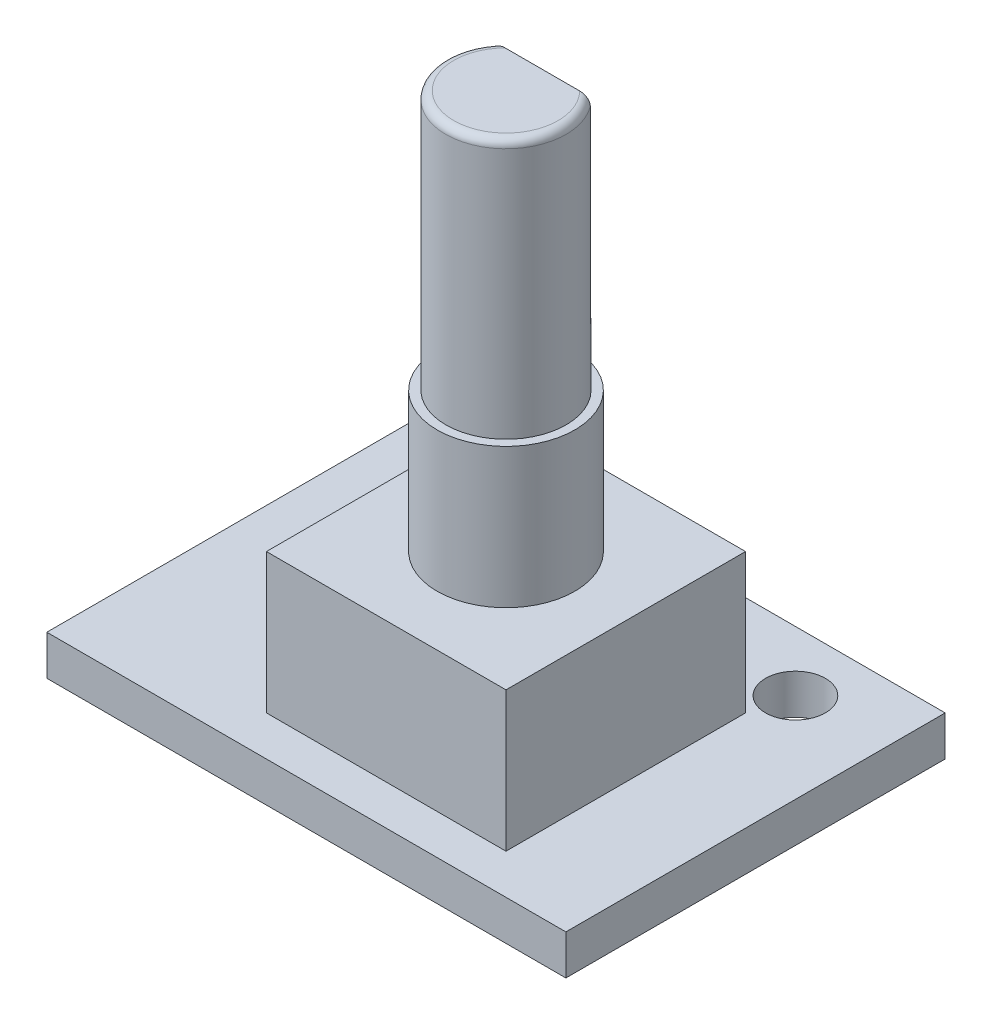
ISO-10303-21;
HEADER;
FILE_DESCRIPTION(('STEP AP214'),'2;1');
FILE_NAME('part.step','',(''),(''),'','','');
FILE_SCHEMA(('AUTOMOTIVE_DESIGN { 1 0 10303 214 1 1 1 1 }'));
ENDSEC;
DATA;
#1=APPLICATION_CONTEXT('core data for automotive mechanical design processes');
#2=APPLICATION_PROTOCOL_DEFINITION('international standard','automotive_design',2000,#1);
#3=PRODUCT_CONTEXT('',#1,'mechanical');
#4=PRODUCT('Part','Part','',(#3));
#5=PRODUCT_RELATED_PRODUCT_CATEGORY('part','',(#4));
#6=PRODUCT_DEFINITION_FORMATION('','',#4);
#7=PRODUCT_DEFINITION_CONTEXT('part definition',#1,'design');
#8=PRODUCT_DEFINITION('design','',#6,#7);
#9=PRODUCT_DEFINITION_SHAPE('','',#8);
#10=(LENGTH_UNIT() NAMED_UNIT(*) SI_UNIT(.MILLI.,.METRE.));
#11=(NAMED_UNIT(*) PLANE_ANGLE_UNIT() SI_UNIT($,.RADIAN.));
#12=(NAMED_UNIT(*) SI_UNIT($,.STERADIAN.) SOLID_ANGLE_UNIT());
#13=UNCERTAINTY_MEASURE_WITH_UNIT(LENGTH_MEASURE(1.E-05),#10,'distance_accuracy_value','');
#14=(GEOMETRIC_REPRESENTATION_CONTEXT(3) GLOBAL_UNCERTAINTY_ASSIGNED_CONTEXT((#13)) GLOBAL_UNIT_ASSIGNED_CONTEXT((#10,
#11,#12)) REPRESENTATION_CONTEXT('',''));
#15=CARTESIAN_POINT('',(0.,0.,0.));
#16=DIRECTION('',(0.,0.,1.));
#17=DIRECTION('',(1.,0.,0.));
#18=AXIS2_PLACEMENT_3D('',#15,#16,#17);
#19=CARTESIAN_POINT('',(0.,2.,0.));
#20=DIRECTION('',(0.,-1.,0.));
#21=DIRECTION('',(0.,0.,-1.));
#22=AXIS2_PLACEMENT_3D('',#19,#20,#21);
#23=PLANE('',#22);
#24=CARTESIAN_POINT('',(4.5,2.,-16.));
#25=DIRECTION('',(0.,1.,0.));
#26=DIRECTION('',(0.,0.,1.));
#27=AXIS2_PLACEMENT_3D('',#24,#25,#26);
#28=CIRCLE('',#27,1.5);
#29=CARTESIAN_POINT('',(4.5,2.,-14.5));
#30=VERTEX_POINT('',#29);
#31=EDGE_CURVE('E434',#30,#30,#28,.T.);
#32=ORIENTED_EDGE('',*,*,#31,.F.);
#33=EDGE_LOOP('',(#32));
#34=FACE_BOUND('',#33,.T.);
#35=CARTESIAN_POINT('',(21.5,2.,-16.));
#36=DIRECTION('',(0.,1.,0.));
#37=DIRECTION('',(0.,0.,1.));
#38=AXIS2_PLACEMENT_3D('',#35,#36,#37);
#39=CIRCLE('',#38,1.5);
#40=CARTESIAN_POINT('',(21.5,2.,-14.5));
#41=VERTEX_POINT('',#40);
#42=EDGE_CURVE('E436',#41,#41,#39,.T.);
#43=ORIENTED_EDGE('',*,*,#42,.F.);
#44=EDGE_LOOP('',(#43));
#45=FACE_BOUND('',#44,.T.);
#46=DIRECTION('',(0.,0.,1.));
#47=VECTOR('',#46,1.);
#48=CARTESIAN_POINT('',(0.,2.,0.));
#49=LINE('',#48,#47);
#50=CARTESIAN_POINT('',(0.,2.,-19.));
#51=VERTEX_POINT('',#50);
#52=CARTESIAN_POINT('',(0.,2.,0.));
#53=VERTEX_POINT('',#52);
#54=EDGE_CURVE('E176',#51,#53,#49,.T.);
#55=ORIENTED_EDGE('',*,*,#54,.T.);
#56=DIRECTION('',(1.,0.,0.));
#57=VECTOR('',#56,1.);
#58=CARTESIAN_POINT('',(0.,2.,0.));
#59=LINE('',#58,#57);
#60=CARTESIAN_POINT('',(26.,2.,0.));
#61=VERTEX_POINT('',#60);
#62=EDGE_CURVE('E179',#53,#61,#59,.T.);
#63=ORIENTED_EDGE('',*,*,#62,.T.);
#64=DIRECTION('',(0.,0.,-1.));
#65=VECTOR('',#64,1.);
#66=CARTESIAN_POINT('',(26.,2.,0.));
#67=LINE('',#66,#65);
#68=CARTESIAN_POINT('',(26.,2.,-19.));
#69=VERTEX_POINT('',#68);
#70=EDGE_CURVE('E182',#61,#69,#67,.T.);
#71=ORIENTED_EDGE('',*,*,#70,.T.);
#72=DIRECTION('',(-1.,0.,0.));
#73=VECTOR('',#72,1.);
#74=CARTESIAN_POINT('',(0.,2.,-19.));
#75=LINE('',#74,#73);
#76=EDGE_CURVE('E184',#69,#51,#75,.T.);
#77=ORIENTED_EDGE('',*,*,#76,.T.);
#78=EDGE_LOOP('',(#55,#63,#71,#77));
#79=FACE_BOUND('',#78,.T.);
#80=DIRECTION('',(0.,0.,-1.));
#81=VECTOR('',#80,1.);
#82=CARTESIAN_POINT('',(21.,2.,-2.));
#83=LINE('',#82,#81);
#84=CARTESIAN_POINT('',(21.,2.,-2.));
#85=VERTEX_POINT('',#84);
#86=CARTESIAN_POINT('',(21.,2.,-14.));
#87=VERTEX_POINT('',#86);
#88=EDGE_CURVE('E140',#85,#87,#83,.T.);
#89=ORIENTED_EDGE('',*,*,#88,.F.);
#90=DIRECTION('',(1.,0.,0.));
#91=VECTOR('',#90,1.);
#92=CARTESIAN_POINT('',(21.,2.,-2.));
#93=LINE('',#92,#91);
#94=CARTESIAN_POINT('',(9.,2.,-2.));
#95=VERTEX_POINT('',#94);
#96=EDGE_CURVE('E147',#95,#85,#93,.T.);
#97=ORIENTED_EDGE('',*,*,#96,.F.);
#98=DIRECTION('',(0.,0.,1.));
#99=VECTOR('',#98,1.);
#100=CARTESIAN_POINT('',(9.,2.,-2.));
#101=LINE('',#100,#99);
#102=CARTESIAN_POINT('',(9.,2.,-14.));
#103=VERTEX_POINT('',#102);
#104=EDGE_CURVE('E159',#103,#95,#101,.T.);
#105=ORIENTED_EDGE('',*,*,#104,.F.);
#106=DIRECTION('',(-1.,0.,0.));
#107=VECTOR('',#106,1.);
#108=CARTESIAN_POINT('',(21.,2.,-14.));
#109=LINE('',#108,#107);
#110=EDGE_CURVE('E156',#87,#103,#109,.T.);
#111=ORIENTED_EDGE('',*,*,#110,.F.);
#112=EDGE_LOOP('',(#89,#97,#105,#111));
#113=FACE_BOUND('',#112,.T.);
#114=ADVANCED_FACE('F34',(#34,#45,#79,#113),#23,.F.);
#115=CARTESIAN_POINT('',(0.,2.,0.));
#116=DIRECTION('',(1.,0.,0.));
#117=DIRECTION('',(0.,0.,-1.));
#118=AXIS2_PLACEMENT_3D('',#115,#116,#117);
#119=PLANE('',#118);
#120=DIRECTION('',(0.,0.,1.));
#121=VECTOR('',#120,1.);
#122=CARTESIAN_POINT('',(0.,0.,0.));
#123=LINE('',#122,#121);
#124=CARTESIAN_POINT('',(0.,0.,-19.));
#125=VERTEX_POINT('',#124);
#126=CARTESIAN_POINT('',(0.,0.,0.));
#127=VERTEX_POINT('',#126);
#128=EDGE_CURVE('E175',#125,#127,#123,.T.);
#129=ORIENTED_EDGE('',*,*,#128,.T.);
#130=DIRECTION('',(0.,-1.,0.));
#131=VECTOR('',#130,1.);
#132=CARTESIAN_POINT('',(0.,2.,0.));
#133=LINE('',#132,#131);
#134=EDGE_CURVE('E202',#53,#127,#133,.T.);
#135=ORIENTED_EDGE('',*,*,#134,.F.);
#136=ORIENTED_EDGE('',*,*,#54,.F.);
#137=DIRECTION('',(0.,-1.,0.));
#138=VECTOR('',#137,1.);
#139=CARTESIAN_POINT('',(0.,2.,-19.));
#140=LINE('',#139,#138);
#141=EDGE_CURVE('E186',#51,#125,#140,.T.);
#142=ORIENTED_EDGE('',*,*,#141,.T.);
#143=EDGE_LOOP('',(#129,#135,#136,#142));
#144=FACE_BOUND('',#143,.T.);
#145=ADVANCED_FACE('F259',(#144),#119,.F.);
#146=CARTESIAN_POINT('',(0.,2.,0.));
#147=DIRECTION('',(0.,0.,-1.));
#148=DIRECTION('',(-1.,0.,0.));
#149=AXIS2_PLACEMENT_3D('',#146,#147,#148);
#150=PLANE('',#149);
#151=DIRECTION('',(1.,0.,0.));
#152=VECTOR('',#151,1.);
#153=CARTESIAN_POINT('',(0.,0.,0.));
#154=LINE('',#153,#152);
#155=CARTESIAN_POINT('',(26.,0.,0.));
#156=VERTEX_POINT('',#155);
#157=EDGE_CURVE('E189',#127,#156,#154,.T.);
#158=ORIENTED_EDGE('',*,*,#157,.T.);
#159=DIRECTION('',(0.,-1.,0.));
#160=VECTOR('',#159,1.);
#161=CARTESIAN_POINT('',(26.,2.,0.));
#162=LINE('',#161,#160);
#163=EDGE_CURVE('E199',#61,#156,#162,.T.);
#164=ORIENTED_EDGE('',*,*,#163,.F.);
#165=ORIENTED_EDGE('',*,*,#62,.F.);
#166=ORIENTED_EDGE('',*,*,#134,.T.);
#167=EDGE_LOOP('',(#158,#164,#165,#166));
#168=FACE_BOUND('',#167,.T.);
#169=ADVANCED_FACE('F271',(#168),#150,.F.);
#170=CARTESIAN_POINT('',(26.,2.,0.));
#171=DIRECTION('',(-1.,0.,0.));
#172=DIRECTION('',(0.,0.,1.));
#173=AXIS2_PLACEMENT_3D('',#170,#171,#172);
#174=PLANE('',#173);
#175=DIRECTION('',(0.,0.,-1.));
#176=VECTOR('',#175,1.);
#177=CARTESIAN_POINT('',(26.,0.,0.));
#178=LINE('',#177,#176);
#179=CARTESIAN_POINT('',(26.,0.,-19.));
#180=VERTEX_POINT('',#179);
#181=EDGE_CURVE('E191',#156,#180,#178,.T.);
#182=ORIENTED_EDGE('',*,*,#181,.T.);
#183=DIRECTION('',(0.,-1.,0.));
#184=VECTOR('',#183,1.);
#185=CARTESIAN_POINT('',(26.,2.,-19.));
#186=LINE('',#185,#184);
#187=EDGE_CURVE('E196',#69,#180,#186,.T.);
#188=ORIENTED_EDGE('',*,*,#187,.F.);
#189=ORIENTED_EDGE('',*,*,#70,.F.);
#190=ORIENTED_EDGE('',*,*,#163,.T.);
#191=EDGE_LOOP('',(#182,#188,#189,#190));
#192=FACE_BOUND('',#191,.T.);
#193=ADVANCED_FACE('F267',(#192),#174,.F.);
#194=CARTESIAN_POINT('',(0.,2.,-19.));
#195=DIRECTION('',(0.,0.,1.));
#196=DIRECTION('',(1.,0.,0.));
#197=AXIS2_PLACEMENT_3D('',#194,#195,#196);
#198=PLANE('',#197);
#199=DIRECTION('',(-1.,0.,0.));
#200=VECTOR('',#199,1.);
#201=CARTESIAN_POINT('',(0.,0.,-19.));
#202=LINE('',#201,#200);
#203=EDGE_CURVE('E180',#180,#125,#202,.T.);
#204=ORIENTED_EDGE('',*,*,#203,.T.);
#205=ORIENTED_EDGE('',*,*,#141,.F.);
#206=ORIENTED_EDGE('',*,*,#76,.F.);
#207=ORIENTED_EDGE('',*,*,#187,.T.);
#208=EDGE_LOOP('',(#204,#205,#206,#207));
#209=FACE_BOUND('',#208,.T.);
#210=ADVANCED_FACE('F263',(#209),#198,.F.);
#211=CARTESIAN_POINT('',(0.,0.,0.));
#212=DIRECTION('',(0.,-1.,0.));
#213=DIRECTION('',(0.,0.,-1.));
#214=AXIS2_PLACEMENT_3D('',#211,#212,#213);
#215=PLANE('',#214);
#216=CARTESIAN_POINT('',(4.5,0.,-16.));
#217=DIRECTION('',(0.,1.,0.));
#218=DIRECTION('',(0.,0.,1.));
#219=AXIS2_PLACEMENT_3D('',#216,#217,#218);
#220=CIRCLE('',#219,1.5);
#221=CARTESIAN_POINT('',(4.5,0.,-14.5));
#222=VERTEX_POINT('',#221);
#223=EDGE_CURVE('E431',#222,#222,#220,.T.);
#224=ORIENTED_EDGE('',*,*,#223,.T.);
#225=EDGE_LOOP('',(#224));
#226=FACE_BOUND('',#225,.T.);
#227=CARTESIAN_POINT('',(21.5,0.,-16.));
#228=DIRECTION('',(0.,1.,0.));
#229=DIRECTION('',(0.,0.,1.));
#230=AXIS2_PLACEMENT_3D('',#227,#228,#229);
#231=CIRCLE('',#230,1.5);
#232=CARTESIAN_POINT('',(21.5,0.,-14.5));
#233=VERTEX_POINT('',#232);
#234=EDGE_CURVE('E439',#233,#233,#231,.T.);
#235=ORIENTED_EDGE('',*,*,#234,.T.);
#236=EDGE_LOOP('',(#235));
#237=FACE_BOUND('',#236,.T.);
#238=ORIENTED_EDGE('',*,*,#128,.F.);
#239=ORIENTED_EDGE('',*,*,#203,.F.);
#240=ORIENTED_EDGE('',*,*,#181,.F.);
#241=ORIENTED_EDGE('',*,*,#157,.F.);
#242=EDGE_LOOP('',(#238,#239,#240,#241));
#243=FACE_BOUND('',#242,.T.);
#244=ADVANCED_FACE('F255',(#226,#237,#243),#215,.T.);
#245=CARTESIAN_POINT('',(21.,9.,-2.));
#246=DIRECTION('',(-1.,0.,0.));
#247=DIRECTION('',(0.,0.,1.));
#248=AXIS2_PLACEMENT_3D('',#245,#246,#247);
#249=PLANE('',#248);
#250=ORIENTED_EDGE('',*,*,#88,.T.);
#251=DIRECTION('',(0.,-1.,0.));
#252=VECTOR('',#251,1.);
#253=CARTESIAN_POINT('',(21.,9.,-14.));
#254=LINE('',#253,#252);
#255=CARTESIAN_POINT('',(21.,9.,-14.));
#256=VERTEX_POINT('',#255);
#257=EDGE_CURVE('E172',#256,#87,#254,.T.);
#258=ORIENTED_EDGE('',*,*,#257,.F.);
#259=DIRECTION('',(0.,0.,-1.));
#260=VECTOR('',#259,1.);
#261=CARTESIAN_POINT('',(21.,9.,-2.));
#262=LINE('',#261,#260);
#263=CARTESIAN_POINT('',(21.,9.,-2.));
#264=VERTEX_POINT('',#263);
#265=EDGE_CURVE('E143',#264,#256,#262,.T.);
#266=ORIENTED_EDGE('',*,*,#265,.F.);
#267=DIRECTION('',(0.,-1.,0.));
#268=VECTOR('',#267,1.);
#269=CARTESIAN_POINT('',(21.,9.,-2.));
#270=LINE('',#269,#268);
#271=EDGE_CURVE('E153',#264,#85,#270,.T.);
#272=ORIENTED_EDGE('',*,*,#271,.T.);
#273=EDGE_LOOP('',(#250,#258,#266,#272));
#274=FACE_BOUND('',#273,.T.);
#275=ADVANCED_FACE('F251',(#274),#249,.F.);
#276=CARTESIAN_POINT('',(21.,9.,-14.));
#277=DIRECTION('',(0.,0.,1.));
#278=DIRECTION('',(1.,0.,0.));
#279=AXIS2_PLACEMENT_3D('',#276,#277,#278);
#280=PLANE('',#279);
#281=ORIENTED_EDGE('',*,*,#110,.T.);
#282=DIRECTION('',(0.,-1.,0.));
#283=VECTOR('',#282,1.);
#284=CARTESIAN_POINT('',(9.,9.,-14.));
#285=LINE('',#284,#283);
#286=CARTESIAN_POINT('',(9.,9.,-14.));
#287=VERTEX_POINT('',#286);
#288=EDGE_CURVE('E169',#287,#103,#285,.T.);
#289=ORIENTED_EDGE('',*,*,#288,.F.);
#290=DIRECTION('',(-1.,0.,0.));
#291=VECTOR('',#290,1.);
#292=CARTESIAN_POINT('',(21.,9.,-14.));
#293=LINE('',#292,#291);
#294=EDGE_CURVE('E146',#256,#287,#293,.T.);
#295=ORIENTED_EDGE('',*,*,#294,.F.);
#296=ORIENTED_EDGE('',*,*,#257,.T.);
#297=EDGE_LOOP('',(#281,#289,#295,#296));
#298=FACE_BOUND('',#297,.T.);
#299=ADVANCED_FACE('F247',(#298),#280,.F.);
#300=CARTESIAN_POINT('',(9.,9.,-2.));
#301=DIRECTION('',(1.,0.,0.));
#302=DIRECTION('',(0.,0.,-1.));
#303=AXIS2_PLACEMENT_3D('',#300,#301,#302);
#304=PLANE('',#303);
#305=ORIENTED_EDGE('',*,*,#104,.T.);
#306=DIRECTION('',(0.,-1.,0.));
#307=VECTOR('',#306,1.);
#308=CARTESIAN_POINT('',(9.,9.,-2.));
#309=LINE('',#308,#307);
#310=CARTESIAN_POINT('',(9.,9.,-2.));
#311=VERTEX_POINT('',#310);
#312=EDGE_CURVE('E166',#311,#95,#309,.T.);
#313=ORIENTED_EDGE('',*,*,#312,.F.);
#314=DIRECTION('',(0.,0.,1.));
#315=VECTOR('',#314,1.);
#316=CARTESIAN_POINT('',(9.,9.,-2.));
#317=LINE('',#316,#315);
#318=EDGE_CURVE('E149',#287,#311,#317,.T.);
#319=ORIENTED_EDGE('',*,*,#318,.F.);
#320=ORIENTED_EDGE('',*,*,#288,.T.);
#321=EDGE_LOOP('',(#305,#313,#319,#320));
#322=FACE_BOUND('',#321,.T.);
#323=ADVANCED_FACE('F243',(#322),#304,.F.);
#324=CARTESIAN_POINT('',(21.,9.,-2.));
#325=DIRECTION('',(0.,0.,-1.));
#326=DIRECTION('',(-1.,0.,0.));
#327=AXIS2_PLACEMENT_3D('',#324,#325,#326);
#328=PLANE('',#327);
#329=ORIENTED_EDGE('',*,*,#96,.T.);
#330=ORIENTED_EDGE('',*,*,#271,.F.);
#331=DIRECTION('',(1.,0.,0.));
#332=VECTOR('',#331,1.);
#333=CARTESIAN_POINT('',(21.,9.,-2.));
#334=LINE('',#333,#332);
#335=EDGE_CURVE('E151',#311,#264,#334,.T.);
#336=ORIENTED_EDGE('',*,*,#335,.F.);
#337=ORIENTED_EDGE('',*,*,#312,.T.);
#338=EDGE_LOOP('',(#329,#330,#336,#337));
#339=FACE_BOUND('',#338,.T.);
#340=ADVANCED_FACE('F239',(#339),#328,.F.);
#341=CARTESIAN_POINT('',(0.,9.,0.));
#342=DIRECTION('',(0.,1.,0.));
#343=DIRECTION('',(0.,0.,1.));
#344=AXIS2_PLACEMENT_3D('',#341,#342,#343);
#345=PLANE('',#344);
#346=CARTESIAN_POINT('',(15.,9.,-8.));
#347=DIRECTION('',(0.,1.,0.));
#348=DIRECTION('',(0.,0.,1.));
#349=AXIS2_PLACEMENT_3D('',#346,#347,#348);
#350=CIRCLE('',#349,3.45);
#351=CARTESIAN_POINT('',(15.,9.,-4.54999999999999));
#352=VERTEX_POINT('',#351);
#353=EDGE_CURVE('E136',#352,#352,#350,.T.);
#354=ORIENTED_EDGE('',*,*,#353,.F.);
#355=EDGE_LOOP('',(#354));
#356=FACE_BOUND('',#355,.T.);
#357=ORIENTED_EDGE('',*,*,#265,.T.);
#358=ORIENTED_EDGE('',*,*,#294,.T.);
#359=ORIENTED_EDGE('',*,*,#318,.T.);
#360=ORIENTED_EDGE('',*,*,#335,.T.);
#361=EDGE_LOOP('',(#357,#358,#359,#360));
#362=FACE_BOUND('',#361,.T.);
#363=ADVANCED_FACE('F235',(#356,#362),#345,.T.);
#364=CARTESIAN_POINT('',(15.,16.,-8.));
#365=DIRECTION('',(0.,-1.,0.));
#366=DIRECTION('',(0.,0.,-1.));
#367=AXIS2_PLACEMENT_3D('',#364,#365,#366);
#368=CYLINDRICAL_SURFACE('',#367,3.45);
#369=CARTESIAN_POINT('',(15.,16.,-8.));
#370=DIRECTION('',(0.,1.,0.));
#371=DIRECTION('',(0.,0.,1.));
#372=AXIS2_PLACEMENT_3D('',#369,#370,#371);
#373=CIRCLE('',#372,3.45);
#374=CARTESIAN_POINT('',(15.,16.,-4.54999999999999));
#375=VERTEX_POINT('',#374);
#376=EDGE_CURVE('E137',#375,#375,#373,.T.);
#377=ORIENTED_EDGE('',*,*,#376,.F.);
#378=EDGE_LOOP('',(#377));
#379=FACE_BOUND('',#378,.T.);
#380=ORIENTED_EDGE('',*,*,#353,.T.);
#381=EDGE_LOOP('',(#380));
#382=FACE_BOUND('',#381,.T.);
#383=ADVANCED_FACE('F231',(#379,#382),#368,.T.);
#384=CARTESIAN_POINT('',(15.,16.,-8.));
#385=DIRECTION('',(0.,1.,0.));
#386=DIRECTION('',(0.,0.,1.));
#387=AXIS2_PLACEMENT_3D('',#384,#385,#386);
#388=PLANE('',#387);
#389=CARTESIAN_POINT('',(15.,16.,-8.));
#390=DIRECTION('',(0.,1.,0.));
#391=DIRECTION('',(0.,0.,1.));
#392=AXIS2_PLACEMENT_3D('',#389,#390,#391);
#393=CIRCLE('',#392,3.01323560845928);
#394=CARTESIAN_POINT('',(15.,16.,-4.98676439154072));
#395=VERTEX_POINT('',#394);
#396=EDGE_CURVE('E130',#395,#395,#393,.T.);
#397=ORIENTED_EDGE('',*,*,#396,.F.);
#398=EDGE_LOOP('',(#397));
#399=FACE_BOUND('',#398,.T.);
#400=ORIENTED_EDGE('',*,*,#376,.T.);
#401=EDGE_LOOP('',(#400));
#402=FACE_BOUND('',#401,.T.);
#403=ADVANCED_FACE('F228',(#399,#402),#388,.T.);
#404=CARTESIAN_POINT('',(15.,29.,-8.));
#405=DIRECTION('',(0.,-1.,0.));
#406=DIRECTION('',(0.,0.,-1.));
#407=AXIS2_PLACEMENT_3D('',#404,#405,#406);
#408=CYLINDRICAL_SURFACE('',#407,3.01323560845928);
#409=DIRECTION('',(0.,1.,0.));
#410=VECTOR('',#409,1.);
#411=CARTESIAN_POINT('',(17.3967098137921,19.,-9.8262997838689));
#412=LINE('',#411,#410);
#413=CARTESIAN_POINT('',(17.3967098137921,19.,-9.8262997838689));
#414=VERTEX_POINT('',#413);
#415=CARTESIAN_POINT('',(17.3967098137921,28.6,-9.8262997838689));
#416=VERTEX_POINT('',#415);
#417=EDGE_CURVE('E125',#414,#416,#412,.T.);
#418=ORIENTED_EDGE('',*,*,#417,.T.);
#419=CARTESIAN_POINT('',(15.,28.6,-8.));
#420=DIRECTION('',(0.,1.,0.));
#421=DIRECTION('',(0.,0.,1.));
#422=AXIS2_PLACEMENT_3D('',#419,#420,#421);
#423=CIRCLE('',#422,3.01323560845928);
#424=CARTESIAN_POINT('',(12.6032901862079,28.6,-9.8262997838689));
#425=VERTEX_POINT('',#424);
#426=EDGE_CURVE('E11',#416,#425,#423,.F.);
#427=ORIENTED_EDGE('',*,*,#426,.T.);
#428=DIRECTION('',(0.,1.,0.));
#429=VECTOR('',#428,1.);
#430=CARTESIAN_POINT('',(12.6032901862079,19.,-9.8262997838689));
#431=LINE('',#430,#429);
#432=CARTESIAN_POINT('',(12.6032901862079,19.,-9.8262997838689));
#433=VERTEX_POINT('',#432);
#434=EDGE_CURVE('E123',#433,#425,#431,.T.);
#435=ORIENTED_EDGE('',*,*,#434,.F.);
#436=CARTESIAN_POINT('',(15.,19.,-8.));
#437=DIRECTION('',(0.,1.,0.));
#438=DIRECTION('',(0.,0.,1.));
#439=AXIS2_PLACEMENT_3D('',#436,#437,#438);
#440=CIRCLE('',#439,3.01323560845928);
#441=EDGE_CURVE('E116',#414,#433,#440,.T.);
#442=ORIENTED_EDGE('',*,*,#441,.F.);
#443=EDGE_LOOP('',(#418,#427,#435,#442));
#444=FACE_BOUND('',#443,.T.);
#445=ORIENTED_EDGE('',*,*,#396,.T.);
#446=EDGE_LOOP('',(#445));
#447=FACE_BOUND('',#446,.T.);
#448=ADVANCED_FACE('F127',(#444,#447),#408,.T.);
#449=CARTESIAN_POINT('',(15.,29.,-8.));
#450=DIRECTION('',(0.,1.,0.));
#451=DIRECTION('',(0.,0.,1.));
#452=AXIS2_PLACEMENT_3D('',#449,#450,#451);
#453=PLANE('',#452);
#454=DIRECTION('',(1.,0.,0.));
#455=VECTOR('',#454,1.);
#456=CARTESIAN_POINT('',(0.,29.,-9.8262997838689));
#457=LINE('',#456,#455);
#458=CARTESIAN_POINT('',(13.1308746845757,29.,-9.8262997838689));
#459=VERTEX_POINT('',#458);
#460=CARTESIAN_POINT('',(16.8691253154243,29.,-9.8262997838689));
#461=VERTEX_POINT('',#460);
#462=EDGE_CURVE('E120',#459,#461,#457,.T.);
#463=ORIENTED_EDGE('',*,*,#462,.F.);
#464=CARTESIAN_POINT('',(15.,29.,-8.));
#465=DIRECTION('',(0.,1.,0.));
#466=DIRECTION('',(0.,0.,1.));
#467=AXIS2_PLACEMENT_3D('',#464,#465,#466);
#468=CIRCLE('',#467,2.61323560845928);
#469=EDGE_CURVE('E205',#459,#461,#468,.T.);
#470=ORIENTED_EDGE('',*,*,#469,.T.);
#471=EDGE_LOOP('',(#463,#470));
#472=FACE_BOUND('',#471,.T.);
#473=ADVANCED_FACE('F220',(#472),#453,.T.);
#474=CARTESIAN_POINT('',(0.,19.,-9.8262997838689));
#475=DIRECTION('',(0.,0.,1.));
#476=DIRECTION('',(1.,0.,0.));
#477=AXIS2_PLACEMENT_3D('',#474,#475,#476);
#478=PLANE('',#477);
#479=ORIENTED_EDGE('',*,*,#462,.T.);
#480=CARTESIAN_POINT('',(16.8691253154243,29.,-9.8262997838689));
#481=CARTESIAN_POINT('',(16.9026987010676,28.9999903840703,-9.8262997838689));
#482=CARTESIAN_POINT('',(16.9363645357687,28.9978335174778,-9.8262997838689));
#483=CARTESIAN_POINT('',(17.0033203691124,28.9887458392818,-9.8262997838689));
#484=CARTESIAN_POINT('',(17.0366048490612,28.9817751481659,-9.8262997838689));
#485=CARTESIAN_POINT('',(17.097226057932,28.9638706693396,-9.8262997838689));
#486=CARTESIAN_POINT('',(17.1247563431395,28.9536042414961,-9.8262997838689));
#487=CARTESIAN_POINT('',(17.1778036370617,28.9288623933219,-9.8262997838689));
#488=CARTESIAN_POINT('',(17.2033264855584,28.9143998026993,-9.8262997838689));
#489=CARTESIAN_POINT('',(17.2465247623365,28.8844331188499,-9.8262997838689));
#490=CARTESIAN_POINT('',(17.264747253137,28.8697201635935,-9.8262997838689));
#491=CARTESIAN_POINT('',(17.2985674596157,28.8375121213463,-9.8262997838689));
#492=CARTESIAN_POINT('',(17.3141668707912,28.8200188458261,-9.8262997838689));
#493=CARTESIAN_POINT('',(17.3397781817976,28.7854084876794,-9.8262997838689));
#494=CARTESIAN_POINT('',(17.3502817521502,28.7686559688231,-9.8262997838689));
#495=CARTESIAN_POINT('',(17.3683480979157,28.7336451884357,-9.8262997838689));
#496=CARTESIAN_POINT('',(17.3759154464342,28.7153893225402,-9.8262997838689));
#497=CARTESIAN_POINT('',(17.3866905013881,28.6810280981694,-9.8262997838689));
#498=CARTESIAN_POINT('',(17.3904211858826,28.6650859663983,-9.8262997838689));
#499=CARTESIAN_POINT('',(17.3954436391838,28.6327691539152,-9.8262997838689));
#500=CARTESIAN_POINT('',(17.3967271663359,28.6163931991878,-9.8262997838689));
#501=CARTESIAN_POINT('',(17.3967098137921,28.6,-9.8262997838689));
#502=B_SPLINE_CURVE_WITH_KNOTS('',3,(#480,#481,#482,#483,#484,#485,#486,#487,#488,#489,#490,
#491,#492,#493,#494,#495,#496,#497,#498,#499,#500,#501),.UNSPECIFIED.,.F.,.F.,(4,2,2,2,2,2,2,2,
2,2,4),(0.,0.100799701096635,0.202444642342909,0.290275434475014,0.377840465219782,
0.447836973768421,0.517788062831526,0.576860790834448,0.635841141379045,0.684777140369589,
0.733877659247944),.UNSPECIFIED.);
#503=EDGE_CURVE('E43',#461,#416,#502,.T.);
#504=ORIENTED_EDGE('',*,*,#503,.T.);
#505=ORIENTED_EDGE('',*,*,#417,.F.);
#506=DIRECTION('',(1.,0.,0.));
#507=VECTOR('',#506,1.);
#508=CARTESIAN_POINT('',(0.,19.,-9.8262997838689));
#509=LINE('',#508,#507);
#510=EDGE_CURVE('E119',#433,#414,#509,.T.);
#511=ORIENTED_EDGE('',*,*,#510,.F.);
#512=ORIENTED_EDGE('',*,*,#434,.T.);
#513=CARTESIAN_POINT('',(12.6032901862079,28.6,-9.8262997838689));
#514=CARTESIAN_POINT('',(12.603256566099,28.6191200152278,-9.8262997838689));
#515=CARTESIAN_POINT('',(12.6050112050229,28.6382117280716,-9.8262997838689));
#516=CARTESIAN_POINT('',(12.611819850808,28.6756911066385,-9.8262997838689));
#517=CARTESIAN_POINT('',(12.6168552571165,28.6940821265022,-9.8262997838689));
#518=CARTESIAN_POINT('',(12.6299450023449,28.7297158063804,-9.8262997838689));
#519=CARTESIAN_POINT('',(12.6379952815388,28.7469599741005,-9.8262997838689));
#520=CARTESIAN_POINT('',(12.6567104032264,28.7799774876788,-9.8262997838689));
#521=CARTESIAN_POINT('',(12.6673783677445,28.7957490459678,-9.8262997838689));
#522=CARTESIAN_POINT('',(12.6916281726505,28.8265104976152,-9.8262997838689));
#523=CARTESIAN_POINT('',(12.7053513983655,28.8413882797962,-9.8262997838689));
#524=CARTESIAN_POINT('',(12.7347335211298,28.8690634332998,-9.8262997838689));
#525=CARTESIAN_POINT('',(12.7503925431852,28.8818606701452,-9.8262997838689));
#526=CARTESIAN_POINT('',(12.7910379963631,28.9109691166397,-9.8262997838689));
#527=CARTESIAN_POINT('',(12.816911759074,28.9260463592602,-9.8262997838689));
#528=CARTESIAN_POINT('',(12.870826628115,28.9518390544474,-9.8262997838689));
#529=CARTESIAN_POINT('',(12.8988763940652,28.9625358911698,-9.8262997838689));
#530=CARTESIAN_POINT('',(12.9605846892303,28.9811353879023,-9.8262997838689));
#531=CARTESIAN_POINT('',(12.9944441939761,28.9883590198057,-9.8262997838689));
#532=CARTESIAN_POINT('',(13.0625319061732,28.9977620810366,-9.8262997838689));
#533=CARTESIAN_POINT('',(13.0967532503715,28.9999902407661,-9.8262997838689));
#534=CARTESIAN_POINT('',(13.1308746845757,29.,-9.8262997838689));
#535=B_SPLINE_CURVE_WITH_KNOTS('',3,(#513,#514,#515,#516,#517,#518,#519,#520,#521,#522,#523,
#524,#525,#526,#527,#528,#529,#530,#531,#532,#533,#534),.UNSPECIFIED.,.F.,.F.,(4,2,2,2,2,2,2,2,
2,2,4),(0.,0.0572350419192325,0.114148376593509,0.170985347652282,0.227890438560791,
0.288386074959751,0.348885619972821,0.438232238936475,0.527954718100981,0.631421246305998,
0.733873993011835),.UNSPECIFIED.);
#536=EDGE_CURVE('E208',#425,#459,#535,.T.);
#537=ORIENTED_EDGE('',*,*,#536,.T.);
#538=EDGE_LOOP('',(#479,#504,#505,#511,#512,#537));
#539=FACE_BOUND('',#538,.T.);
#540=ADVANCED_FACE('F122',(#539),#478,.F.);
#541=CARTESIAN_POINT('',(0.,19.,0.));
#542=DIRECTION('',(0.,1.,0.));
#543=DIRECTION('',(0.,0.,1.));
#544=AXIS2_PLACEMENT_3D('',#541,#542,#543);
#545=PLANE('',#544);
#546=ORIENTED_EDGE('',*,*,#441,.T.);
#547=ORIENTED_EDGE('',*,*,#510,.T.);
#548=EDGE_LOOP('',(#546,#547));
#549=FACE_BOUND('',#548,.T.);
#550=ADVANCED_FACE('F118',(#549),#545,.T.);
#551=CARTESIAN_POINT('',(15.,28.6,-8.));
#552=DIRECTION('',(0.,1.,0.));
#553=DIRECTION('',(0.,0.,1.));
#554=AXIS2_PLACEMENT_3D('',#551,#552,#553);
#555=TOROIDAL_SURFACE('',#554,2.61323560845928,0.4);
#556=ORIENTED_EDGE('',*,*,#536,.F.);
#557=ORIENTED_EDGE('',*,*,#426,.F.);
#558=ORIENTED_EDGE('',*,*,#503,.F.);
#559=ORIENTED_EDGE('',*,*,#469,.F.);
#560=EDGE_LOOP('',(#556,#557,#558,#559));
#561=FACE_BOUND('',#560,.T.);
#562=ADVANCED_FACE('F36',(#561),#555,.T.);
#563=CARTESIAN_POINT('',(21.5,0.,-16.));
#564=DIRECTION('',(0.,1.,0.));
#565=DIRECTION('',(0.,0.,1.));
#566=AXIS2_PLACEMENT_3D('',#563,#564,#565);
#567=CYLINDRICAL_SURFACE('',#566,1.5);
#568=ORIENTED_EDGE('',*,*,#234,.F.);
#569=EDGE_LOOP('',(#568));
#570=FACE_BOUND('',#569,.T.);
#571=ORIENTED_EDGE('',*,*,#42,.T.);
#572=EDGE_LOOP('',(#571));
#573=FACE_BOUND('',#572,.T.);
#574=ADVANCED_FACE('F370',(#570,#573),#567,.F.);
#575=CARTESIAN_POINT('',(4.5,0.,-16.));
#576=DIRECTION('',(0.,1.,0.));
#577=DIRECTION('',(0.,0.,1.));
#578=AXIS2_PLACEMENT_3D('',#575,#576,#577);
#579=CYLINDRICAL_SURFACE('',#578,1.5);
#580=ORIENTED_EDGE('',*,*,#223,.F.);
#581=EDGE_LOOP('',(#580));
#582=FACE_BOUND('',#581,.T.);
#583=ORIENTED_EDGE('',*,*,#31,.T.);
#584=EDGE_LOOP('',(#583));
#585=FACE_BOUND('',#584,.T.);
#586=ADVANCED_FACE('F376',(#582,#585),#579,.F.);
#587=CLOSED_SHELL('',(#114,#145,#169,#193,#210,#244,#275,#299,#323,#340,#363,#383,#403,#448,
#473,#540,#550,#562,#574,#586));
#588=MANIFOLD_SOLID_BREP('B2',#587);
#589=ADVANCED_BREP_SHAPE_REPRESENTATION('',(#18,#588),#14);
#590=SHAPE_DEFINITION_REPRESENTATION(#9,#589);
ENDSEC;
END-ISO-10303-21;
